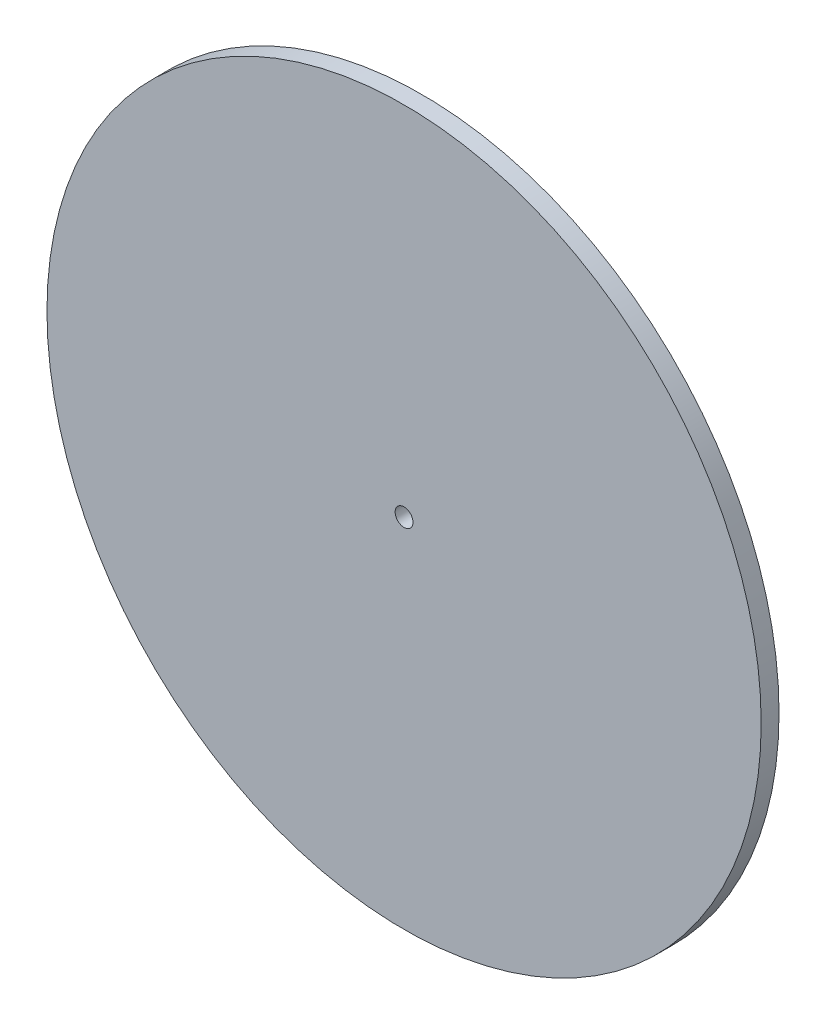
ISO-10303-21;
HEADER;
FILE_DESCRIPTION(('STEP AP214'),'2;1');
FILE_NAME('part.step','',(''),(''),'','','');
FILE_SCHEMA(('AUTOMOTIVE_DESIGN { 1 0 10303 214 1 1 1 1 }'));
ENDSEC;
DATA;
#1=APPLICATION_CONTEXT('core data for automotive mechanical design processes');
#2=APPLICATION_PROTOCOL_DEFINITION('international standard','automotive_design',2000,#1);
#3=PRODUCT_CONTEXT('',#1,'mechanical');
#4=PRODUCT('Part','Part','',(#3));
#5=PRODUCT_RELATED_PRODUCT_CATEGORY('part','',(#4));
#6=PRODUCT_DEFINITION_FORMATION('','',#4);
#7=PRODUCT_DEFINITION_CONTEXT('part definition',#1,'design');
#8=PRODUCT_DEFINITION('design','',#6,#7);
#9=PRODUCT_DEFINITION_SHAPE('','',#8);
#10=(LENGTH_UNIT() NAMED_UNIT(*) SI_UNIT(.MILLI.,.METRE.));
#11=(NAMED_UNIT(*) PLANE_ANGLE_UNIT() SI_UNIT($,.RADIAN.));
#12=(NAMED_UNIT(*) SI_UNIT($,.STERADIAN.) SOLID_ANGLE_UNIT());
#13=UNCERTAINTY_MEASURE_WITH_UNIT(LENGTH_MEASURE(1.E-05),#10,'distance_accuracy_value','');
#14=(GEOMETRIC_REPRESENTATION_CONTEXT(3) GLOBAL_UNCERTAINTY_ASSIGNED_CONTEXT((#13)) GLOBAL_UNIT_ASSIGNED_CONTEXT((#10,
#11,#12)) REPRESENTATION_CONTEXT('',''));
#15=CARTESIAN_POINT('',(0.,0.,0.));
#16=DIRECTION('',(0.,0.,1.));
#17=DIRECTION('',(1.,0.,0.));
#18=AXIS2_PLACEMENT_3D('',#15,#16,#17);
#19=CARTESIAN_POINT('',(0.,0.,-5.));
#20=DIRECTION('',(0.,0.,1.));
#21=DIRECTION('',(1.,0.,0.));
#22=AXIS2_PLACEMENT_3D('',#19,#20,#21);
#23=CYLINDRICAL_SURFACE('',#22,100.);
#24=CARTESIAN_POINT('',(0.,0.,-5.));
#25=DIRECTION('',(0.,0.,1.));
#26=DIRECTION('',(1.,0.,0.));
#27=AXIS2_PLACEMENT_3D('',#24,#25,#26);
#28=CIRCLE('',#27,100.);
#29=CARTESIAN_POINT('',(100.,0.,-5.));
#30=VERTEX_POINT('',#29);
#31=EDGE_CURVE('E10',#30,#30,#28,.T.);
#32=ORIENTED_EDGE('',*,*,#31,.T.);
#33=EDGE_LOOP('',(#32));
#34=FACE_BOUND('',#33,.T.);
#35=CARTESIAN_POINT('',(0.,0.,0.));
#36=DIRECTION('',(0.,0.,1.));
#37=DIRECTION('',(1.,0.,0.));
#38=AXIS2_PLACEMENT_3D('',#35,#36,#37);
#39=CIRCLE('',#38,100.);
#40=CARTESIAN_POINT('',(100.,0.,0.));
#41=VERTEX_POINT('',#40);
#42=EDGE_CURVE('E34',#41,#41,#39,.T.);
#43=ORIENTED_EDGE('',*,*,#42,.F.);
#44=EDGE_LOOP('',(#43));
#45=FACE_BOUND('',#44,.T.);
#46=ADVANCED_FACE('F31',(#34,#45),#23,.T.);
#47=CARTESIAN_POINT('',(0.,0.,-5.));
#48=DIRECTION('',(0.,0.,1.));
#49=DIRECTION('',(1.,0.,0.));
#50=AXIS2_PLACEMENT_3D('',#47,#48,#49);
#51=PLANE('',#50);
#52=CARTESIAN_POINT('',(0.,0.,-5.));
#53=DIRECTION('',(0.,0.,1.));
#54=DIRECTION('',(1.,0.,0.));
#55=AXIS2_PLACEMENT_3D('',#52,#53,#54);
#56=CIRCLE('',#55,2.5);
#57=CARTESIAN_POINT('',(2.5,0.,-5.));
#58=VERTEX_POINT('',#57);
#59=EDGE_CURVE('E41',#58,#58,#56,.T.);
#60=ORIENTED_EDGE('',*,*,#59,.T.);
#61=EDGE_LOOP('',(#60));
#62=FACE_BOUND('',#61,.T.);
#63=ORIENTED_EDGE('',*,*,#31,.F.);
#64=EDGE_LOOP('',(#63));
#65=FACE_BOUND('',#64,.T.);
#66=ADVANCED_FACE('F49',(#62,#65),#51,.F.);
#67=CARTESIAN_POINT('',(0.,0.,0.));
#68=DIRECTION('',(0.,0.,1.));
#69=DIRECTION('',(1.,0.,0.));
#70=AXIS2_PLACEMENT_3D('',#67,#68,#69);
#71=PLANE('',#70);
#72=CARTESIAN_POINT('',(0.,0.,0.));
#73=DIRECTION('',(0.,0.,1.));
#74=DIRECTION('',(1.,0.,0.));
#75=AXIS2_PLACEMENT_3D('',#72,#73,#74);
#76=CIRCLE('',#75,2.5);
#77=CARTESIAN_POINT('',(2.5,0.,0.));
#78=VERTEX_POINT('',#77);
#79=EDGE_CURVE('E43',#78,#78,#76,.T.);
#80=ORIENTED_EDGE('',*,*,#79,.F.);
#81=EDGE_LOOP('',(#80));
#82=FACE_BOUND('',#81,.T.);
#83=ORIENTED_EDGE('',*,*,#42,.T.);
#84=EDGE_LOOP('',(#83));
#85=FACE_BOUND('',#84,.T.);
#86=ADVANCED_FACE('F55',(#82,#85),#71,.T.);
#87=CARTESIAN_POINT('',(0.,0.,-5.));
#88=DIRECTION('',(0.,0.,1.));
#89=DIRECTION('',(1.,0.,0.));
#90=AXIS2_PLACEMENT_3D('',#87,#88,#89);
#91=CYLINDRICAL_SURFACE('',#90,2.5);
#92=ORIENTED_EDGE('',*,*,#59,.F.);
#93=EDGE_LOOP('',(#92));
#94=FACE_BOUND('',#93,.T.);
#95=ORIENTED_EDGE('',*,*,#79,.T.);
#96=EDGE_LOOP('',(#95));
#97=FACE_BOUND('',#96,.T.);
#98=ADVANCED_FACE('F52',(#94,#97),#91,.F.);
#99=CLOSED_SHELL('',(#46,#66,#86,#98));
#100=MANIFOLD_SOLID_BREP('B2',#99);
#101=ADVANCED_BREP_SHAPE_REPRESENTATION('',(#18,#100),#14);
#102=SHAPE_DEFINITION_REPRESENTATION(#9,#101);
ENDSEC;
END-ISO-10303-21;
